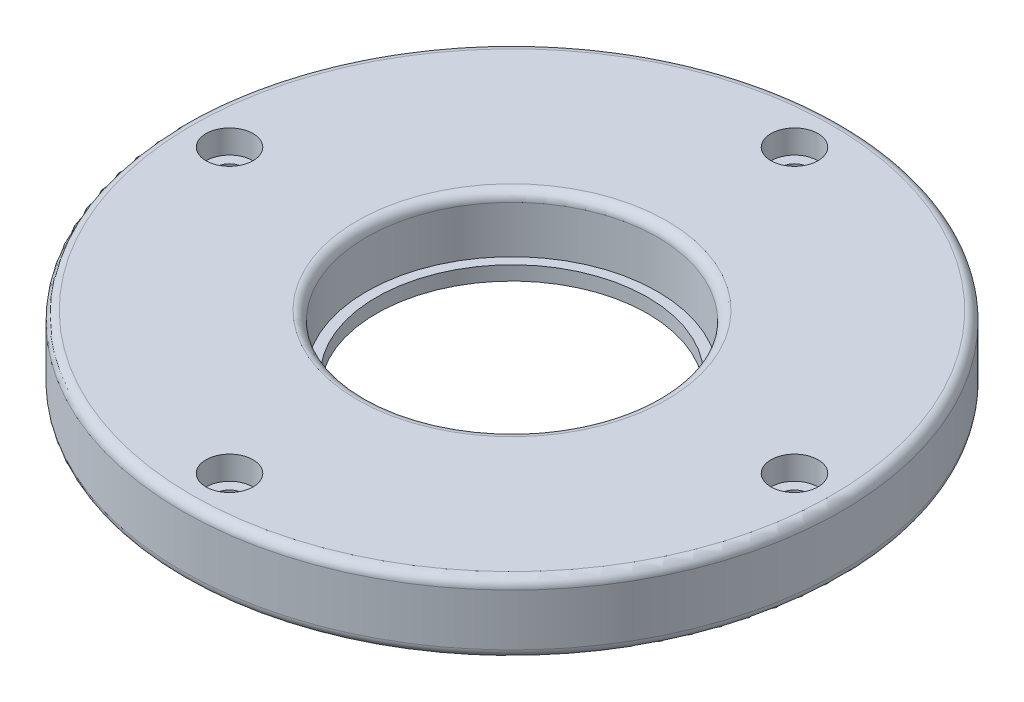
ISO-10303-21;
HEADER;
FILE_DESCRIPTION(('STEP AP214'),'2;1');
FILE_NAME('part.step','',(''),(''),'','','');
FILE_SCHEMA(('AUTOMOTIVE_DESIGN { 1 0 10303 214 1 1 1 1 }'));
ENDSEC;
DATA;
#1=APPLICATION_CONTEXT('core data for automotive mechanical design processes');
#2=APPLICATION_PROTOCOL_DEFINITION('international standard','automotive_design',2000,#1);
#3=PRODUCT_CONTEXT('',#1,'mechanical');
#4=PRODUCT('Part','Part','',(#3));
#5=PRODUCT_RELATED_PRODUCT_CATEGORY('part','',(#4));
#6=PRODUCT_DEFINITION_FORMATION('','',#4);
#7=PRODUCT_DEFINITION_CONTEXT('part definition',#1,'design');
#8=PRODUCT_DEFINITION('design','',#6,#7);
#9=PRODUCT_DEFINITION_SHAPE('','',#8);
#10=(LENGTH_UNIT() NAMED_UNIT(*) SI_UNIT(.MILLI.,.METRE.));
#11=(NAMED_UNIT(*) PLANE_ANGLE_UNIT() SI_UNIT($,.RADIAN.));
#12=(NAMED_UNIT(*) SI_UNIT($,.STERADIAN.) SOLID_ANGLE_UNIT());
#13=UNCERTAINTY_MEASURE_WITH_UNIT(LENGTH_MEASURE(1.E-05),#10,'distance_accuracy_value','');
#14=(GEOMETRIC_REPRESENTATION_CONTEXT(3) GLOBAL_UNCERTAINTY_ASSIGNED_CONTEXT((#13)) GLOBAL_UNIT_ASSIGNED_CONTEXT((#10,
#11,#12)) REPRESENTATION_CONTEXT('',''));
#15=CARTESIAN_POINT('',(0.,0.,0.));
#16=DIRECTION('',(0.,0.,1.));
#17=DIRECTION('',(1.,0.,0.));
#18=AXIS2_PLACEMENT_3D('',#15,#16,#17);
#19=CARTESIAN_POINT('',(0.,15.,0.));
#20=DIRECTION('',(0.,-1.,0.));
#21=DIRECTION('',(0.,0.,-1.));
#22=AXIS2_PLACEMENT_3D('',#19,#20,#21);
#23=CYLINDRICAL_SURFACE('',#22,70.);
#24=CARTESIAN_POINT('',(0.,2.,0.));
#25=DIRECTION('',(0.,1.,0.));
#26=DIRECTION('',(0.,0.,1.));
#27=AXIS2_PLACEMENT_3D('',#24,#25,#26);
#28=CIRCLE('',#27,70.);
#29=CARTESIAN_POINT('',(0.,2.,70.));
#30=VERTEX_POINT('',#29);
#31=EDGE_CURVE('E65',#30,#30,#28,.T.);
#32=ORIENTED_EDGE('',*,*,#31,.T.);
#33=EDGE_LOOP('',(#32));
#34=FACE_BOUND('',#33,.T.);
#35=CARTESIAN_POINT('',(0.,13.,0.));
#36=DIRECTION('',(0.,1.,0.));
#37=DIRECTION('',(0.,0.,1.));
#38=AXIS2_PLACEMENT_3D('',#35,#36,#37);
#39=CIRCLE('',#38,70.);
#40=CARTESIAN_POINT('',(0.,13.,70.));
#41=VERTEX_POINT('',#40);
#42=EDGE_CURVE('E69',#41,#41,#39,.F.);
#43=ORIENTED_EDGE('',*,*,#42,.T.);
#44=EDGE_LOOP('',(#43));
#45=FACE_BOUND('',#44,.T.);
#46=ADVANCED_FACE('F41',(#34,#45),#23,.T.);
#47=CARTESIAN_POINT('',(0.,15.,0.));
#48=DIRECTION('',(0.,1.,0.));
#49=DIRECTION('',(0.,0.,1.));
#50=AXIS2_PLACEMENT_3D('',#47,#48,#49);
#51=PLANE('',#50);
#52=CARTESIAN_POINT('',(0.,15.,-60.));
#53=DIRECTION('',(0.,1.,0.));
#54=DIRECTION('',(0.,0.,1.));
#55=AXIS2_PLACEMENT_3D('',#52,#53,#54);
#56=CIRCLE('',#55,5.);
#57=CARTESIAN_POINT('',(0.,15.,-55.));
#58=VERTEX_POINT('',#57);
#59=EDGE_CURVE('E145',#58,#58,#56,.T.);
#60=ORIENTED_EDGE('',*,*,#59,.F.);
#61=EDGE_LOOP('',(#60));
#62=FACE_BOUND('',#61,.T.);
#63=CARTESIAN_POINT('',(60.,15.,0.));
#64=DIRECTION('',(0.,1.,0.));
#65=DIRECTION('',(0.,0.,1.));
#66=AXIS2_PLACEMENT_3D('',#63,#64,#65);
#67=CIRCLE('',#66,5.);
#68=CARTESIAN_POINT('',(60.,15.,4.99999999999998));
#69=VERTEX_POINT('',#68);
#70=EDGE_CURVE('E129',#69,#69,#67,.T.);
#71=ORIENTED_EDGE('',*,*,#70,.F.);
#72=EDGE_LOOP('',(#71));
#73=FACE_BOUND('',#72,.T.);
#74=CARTESIAN_POINT('',(-60.,15.,0.));
#75=DIRECTION('',(0.,1.,0.));
#76=DIRECTION('',(0.,0.,1.));
#77=AXIS2_PLACEMENT_3D('',#74,#75,#76);
#78=CIRCLE('',#77,5.);
#79=CARTESIAN_POINT('',(-60.,15.,5.));
#80=VERTEX_POINT('',#79);
#81=EDGE_CURVE('E113',#80,#80,#78,.T.);
#82=ORIENTED_EDGE('',*,*,#81,.F.);
#83=EDGE_LOOP('',(#82));
#84=FACE_BOUND('',#83,.T.);
#85=CARTESIAN_POINT('',(0.,15.,60.));
#86=DIRECTION('',(0.,1.,0.));
#87=DIRECTION('',(0.,0.,1.));
#88=AXIS2_PLACEMENT_3D('',#85,#86,#87);
#89=CIRCLE('',#88,5.);
#90=CARTESIAN_POINT('',(0.,15.,65.));
#91=VERTEX_POINT('',#90);
#92=EDGE_CURVE('E97',#91,#91,#89,.T.);
#93=ORIENTED_EDGE('',*,*,#92,.F.);
#94=EDGE_LOOP('',(#93));
#95=FACE_BOUND('',#94,.T.);
#96=CARTESIAN_POINT('',(0.,15.,0.));
#97=DIRECTION('',(0.,1.,0.));
#98=DIRECTION('',(0.,0.,1.));
#99=AXIS2_PLACEMENT_3D('',#96,#97,#98);
#100=CIRCLE('',#99,68.);
#101=CARTESIAN_POINT('',(0.,15.,68.));
#102=VERTEX_POINT('',#101);
#103=EDGE_CURVE('E49',#102,#102,#100,.T.);
#104=ORIENTED_EDGE('',*,*,#103,.T.);
#105=EDGE_LOOP('',(#104));
#106=FACE_BOUND('',#105,.T.);
#107=CARTESIAN_POINT('',(0.,15.,0.));
#108=DIRECTION('',(0.,1.,0.));
#109=DIRECTION('',(0.,0.,1.));
#110=AXIS2_PLACEMENT_3D('',#107,#108,#109);
#111=CIRCLE('',#110,32.9);
#112=CARTESIAN_POINT('',(0.,15.,32.9));
#113=VERTEX_POINT('',#112);
#114=EDGE_CURVE('E54',#113,#113,#111,.F.);
#115=ORIENTED_EDGE('',*,*,#114,.T.);
#116=EDGE_LOOP('',(#115));
#117=FACE_BOUND('',#116,.T.);
#118=ADVANCED_FACE('F152',(#62,#73,#84,#95,#106,#117),#51,.T.);
#119=CARTESIAN_POINT('',(0.,0.,0.));
#120=DIRECTION('',(0.,1.,0.));
#121=DIRECTION('',(0.,0.,1.));
#122=AXIS2_PLACEMENT_3D('',#119,#120,#121);
#123=PLANE('',#122);
#124=CARTESIAN_POINT('',(0.,0.,-60.));
#125=DIRECTION('',(0.,1.,0.));
#126=DIRECTION('',(0.,0.,1.));
#127=AXIS2_PLACEMENT_3D('',#124,#125,#126);
#128=CIRCLE('',#127,2.75);
#129=CARTESIAN_POINT('',(0.,0.,-57.25));
#130=VERTEX_POINT('',#129);
#131=EDGE_CURVE('E133',#130,#130,#128,.T.);
#132=ORIENTED_EDGE('',*,*,#131,.T.);
#133=EDGE_LOOP('',(#132));
#134=FACE_BOUND('',#133,.T.);
#135=CARTESIAN_POINT('',(60.,0.,0.));
#136=DIRECTION('',(0.,1.,0.));
#137=DIRECTION('',(0.,0.,1.));
#138=AXIS2_PLACEMENT_3D('',#135,#136,#137);
#139=CIRCLE('',#138,2.75);
#140=CARTESIAN_POINT('',(60.,0.,2.74999999999998));
#141=VERTEX_POINT('',#140);
#142=EDGE_CURVE('E117',#141,#141,#139,.T.);
#143=ORIENTED_EDGE('',*,*,#142,.T.);
#144=EDGE_LOOP('',(#143));
#145=FACE_BOUND('',#144,.T.);
#146=CARTESIAN_POINT('',(-60.,0.,0.));
#147=DIRECTION('',(0.,1.,0.));
#148=DIRECTION('',(0.,0.,1.));
#149=AXIS2_PLACEMENT_3D('',#146,#147,#148);
#150=CIRCLE('',#149,2.75);
#151=CARTESIAN_POINT('',(-60.,0.,2.75));
#152=VERTEX_POINT('',#151);
#153=EDGE_CURVE('E101',#152,#152,#150,.T.);
#154=ORIENTED_EDGE('',*,*,#153,.T.);
#155=EDGE_LOOP('',(#154));
#156=FACE_BOUND('',#155,.T.);
#157=CARTESIAN_POINT('',(0.,0.,60.));
#158=DIRECTION('',(0.,1.,0.));
#159=DIRECTION('',(0.,0.,1.));
#160=AXIS2_PLACEMENT_3D('',#157,#158,#159);
#161=CIRCLE('',#160,2.75);
#162=CARTESIAN_POINT('',(0.,0.,62.75));
#163=VERTEX_POINT('',#162);
#164=EDGE_CURVE('E82',#163,#163,#161,.T.);
#165=ORIENTED_EDGE('',*,*,#164,.T.);
#166=EDGE_LOOP('',(#165));
#167=FACE_BOUND('',#166,.T.);
#168=CARTESIAN_POINT('',(0.,0.,0.));
#169=DIRECTION('',(0.,1.,0.));
#170=DIRECTION('',(0.,0.,1.));
#171=AXIS2_PLACEMENT_3D('',#168,#169,#170);
#172=CIRCLE('',#171,68.);
#173=CARTESIAN_POINT('',(0.,0.,68.));
#174=VERTEX_POINT('',#173);
#175=EDGE_CURVE('E59',#174,#174,#172,.F.);
#176=ORIENTED_EDGE('',*,*,#175,.T.);
#177=EDGE_LOOP('',(#176));
#178=FACE_BOUND('',#177,.T.);
#179=CARTESIAN_POINT('',(0.,0.,0.));
#180=DIRECTION('',(0.,1.,0.));
#181=DIRECTION('',(0.,0.,1.));
#182=AXIS2_PLACEMENT_3D('',#179,#180,#181);
#183=CIRCLE('',#182,28.8);
#184=CARTESIAN_POINT('',(0.,0.,28.8));
#185=VERTEX_POINT('',#184);
#186=EDGE_CURVE('E77',#185,#185,#183,.T.);
#187=ORIENTED_EDGE('',*,*,#186,.T.);
#188=EDGE_LOOP('',(#187));
#189=FACE_BOUND('',#188,.T.);
#190=ADVANCED_FACE('F155',(#134,#145,#156,#167,#178,#189),#123,.F.);
#191=CARTESIAN_POINT('',(0.,3.,0.));
#192=DIRECTION('',(0.,1.,0.));
#193=DIRECTION('',(0.,0.,1.));
#194=AXIS2_PLACEMENT_3D('',#191,#192,#193);
#195=CYLINDRICAL_SURFACE('',#194,30.9);
#196=CARTESIAN_POINT('',(0.,13.,0.));
#197=DIRECTION('',(0.,1.,0.));
#198=DIRECTION('',(0.,0.,1.));
#199=AXIS2_PLACEMENT_3D('',#196,#197,#198);
#200=CIRCLE('',#199,30.9);
#201=CARTESIAN_POINT('',(0.,13.,30.9));
#202=VERTEX_POINT('',#201);
#203=EDGE_CURVE('E10',#202,#202,#200,.T.);
#204=ORIENTED_EDGE('',*,*,#203,.T.);
#205=EDGE_LOOP('',(#204));
#206=FACE_BOUND('',#205,.T.);
#207=CARTESIAN_POINT('',(0.,3.,0.));
#208=DIRECTION('',(0.,1.,0.));
#209=DIRECTION('',(0.,0.,1.));
#210=AXIS2_PLACEMENT_3D('',#207,#208,#209);
#211=CIRCLE('',#210,30.9);
#212=CARTESIAN_POINT('',(0.,3.,30.9));
#213=VERTEX_POINT('',#212);
#214=EDGE_CURVE('E73',#213,#213,#211,.T.);
#215=ORIENTED_EDGE('',*,*,#214,.F.);
#216=EDGE_LOOP('',(#215));
#217=FACE_BOUND('',#216,.T.);
#218=ADVANCED_FACE('F201',(#206,#217),#195,.F.);
#219=CARTESIAN_POINT('',(0.,3.,0.));
#220=DIRECTION('',(0.,1.,0.));
#221=DIRECTION('',(0.,0.,1.));
#222=AXIS2_PLACEMENT_3D('',#219,#220,#221);
#223=PLANE('',#222);
#224=CARTESIAN_POINT('',(0.,3.,0.));
#225=DIRECTION('',(0.,1.,0.));
#226=DIRECTION('',(0.,0.,1.));
#227=AXIS2_PLACEMENT_3D('',#224,#225,#226);
#228=CIRCLE('',#227,28.8);
#229=CARTESIAN_POINT('',(0.,3.,28.8));
#230=VERTEX_POINT('',#229);
#231=EDGE_CURVE('E78',#230,#230,#228,.T.);
#232=ORIENTED_EDGE('',*,*,#231,.F.);
#233=EDGE_LOOP('',(#232));
#234=FACE_BOUND('',#233,.T.);
#235=ORIENTED_EDGE('',*,*,#214,.T.);
#236=EDGE_LOOP('',(#235));
#237=FACE_BOUND('',#236,.T.);
#238=ADVANCED_FACE('F192',(#234,#237),#223,.T.);
#239=CARTESIAN_POINT('',(0.,0.,0.));
#240=DIRECTION('',(0.,1.,0.));
#241=DIRECTION('',(0.,0.,1.));
#242=AXIS2_PLACEMENT_3D('',#239,#240,#241);
#243=CYLINDRICAL_SURFACE('',#242,28.8);
#244=ORIENTED_EDGE('',*,*,#186,.F.);
#245=EDGE_LOOP('',(#244));
#246=FACE_BOUND('',#245,.T.);
#247=ORIENTED_EDGE('',*,*,#231,.T.);
#248=EDGE_LOOP('',(#247));
#249=FACE_BOUND('',#248,.T.);
#250=ADVANCED_FACE('F187',(#246,#249),#243,.F.);
#251=CARTESIAN_POINT('',(0.,2.,0.));
#252=DIRECTION('',(0.,1.,0.));
#253=DIRECTION('',(0.,0.,1.));
#254=AXIS2_PLACEMENT_3D('',#251,#252,#253);
#255=TOROIDAL_SURFACE('',#254,68.,2.);
#256=ORIENTED_EDGE('',*,*,#175,.F.);
#257=EDGE_LOOP('',(#256));
#258=FACE_BOUND('',#257,.T.);
#259=ORIENTED_EDGE('',*,*,#31,.F.);
#260=EDGE_LOOP('',(#259));
#261=FACE_BOUND('',#260,.T.);
#262=ADVANCED_FACE('F176',(#258,#261),#255,.T.);
#263=CARTESIAN_POINT('',(0.,13.,0.));
#264=DIRECTION('',(0.,1.,0.));
#265=DIRECTION('',(0.,0.,1.));
#266=AXIS2_PLACEMENT_3D('',#263,#264,#265);
#267=TOROIDAL_SURFACE('',#266,68.,2.);
#268=ORIENTED_EDGE('',*,*,#42,.F.);
#269=EDGE_LOOP('',(#268));
#270=FACE_BOUND('',#269,.T.);
#271=ORIENTED_EDGE('',*,*,#103,.F.);
#272=EDGE_LOOP('',(#271));
#273=FACE_BOUND('',#272,.T.);
#274=ADVANCED_FACE('F168',(#270,#273),#267,.T.);
#275=CARTESIAN_POINT('',(0.,13.,0.));
#276=DIRECTION('',(0.,1.,0.));
#277=DIRECTION('',(0.,0.,1.));
#278=AXIS2_PLACEMENT_3D('',#275,#276,#277);
#279=TOROIDAL_SURFACE('',#278,32.9,2.);
#280=ORIENTED_EDGE('',*,*,#114,.F.);
#281=EDGE_LOOP('',(#280));
#282=FACE_BOUND('',#281,.T.);
#283=ORIENTED_EDGE('',*,*,#203,.F.);
#284=EDGE_LOOP('',(#283));
#285=FACE_BOUND('',#284,.T.);
#286=ADVANCED_FACE('F43',(#282,#285),#279,.T.);
#287=CARTESIAN_POINT('',(0.,15.,60.));
#288=DIRECTION('',(0.,1.,0.));
#289=DIRECTION('',(0.,0.,1.));
#290=AXIS2_PLACEMENT_3D('',#287,#288,#289);
#291=CYLINDRICAL_SURFACE('',#290,2.75);
#292=ORIENTED_EDGE('',*,*,#164,.F.);
#293=EDGE_LOOP('',(#292));
#294=FACE_BOUND('',#293,.T.);
#295=CARTESIAN_POINT('',(0.,10.,60.));
#296=DIRECTION('',(0.,1.,0.));
#297=DIRECTION('',(0.,0.,1.));
#298=AXIS2_PLACEMENT_3D('',#295,#296,#297);
#299=CIRCLE('',#298,2.75);
#300=CARTESIAN_POINT('',(0.,10.,62.75));
#301=VERTEX_POINT('',#300);
#302=EDGE_CURVE('E89',#301,#301,#299,.T.);
#303=ORIENTED_EDGE('',*,*,#302,.T.);
#304=EDGE_LOOP('',(#303));
#305=FACE_BOUND('',#304,.T.);
#306=ADVANCED_FACE('F167',(#294,#305),#291,.F.);
#307=CARTESIAN_POINT('',(2.75000000000001,10.,60.));
#308=DIRECTION('',(0.,-1.,0.));
#309=DIRECTION('',(0.,0.,-1.));
#310=AXIS2_PLACEMENT_3D('',#307,#308,#309);
#311=PLANE('',#310);
#312=ORIENTED_EDGE('',*,*,#302,.F.);
#313=EDGE_LOOP('',(#312));
#314=FACE_BOUND('',#313,.T.);
#315=CARTESIAN_POINT('',(0.,10.,60.));
#316=DIRECTION('',(0.,1.,0.));
#317=DIRECTION('',(0.,0.,1.));
#318=AXIS2_PLACEMENT_3D('',#315,#316,#317);
#319=CIRCLE('',#318,5.);
#320=CARTESIAN_POINT('',(0.,10.,65.));
#321=VERTEX_POINT('',#320);
#322=EDGE_CURVE('E93',#321,#321,#319,.T.);
#323=ORIENTED_EDGE('',*,*,#322,.T.);
#324=EDGE_LOOP('',(#323));
#325=FACE_BOUND('',#324,.T.);
#326=ADVANCED_FACE('F173',(#314,#325),#311,.F.);
#327=CARTESIAN_POINT('',(0.,15.,60.));
#328=DIRECTION('',(0.,1.,0.));
#329=DIRECTION('',(0.,0.,1.));
#330=AXIS2_PLACEMENT_3D('',#327,#328,#329);
#331=CYLINDRICAL_SURFACE('',#330,5.);
#332=ORIENTED_EDGE('',*,*,#322,.F.);
#333=EDGE_LOOP('',(#332));
#334=FACE_BOUND('',#333,.T.);
#335=ORIENTED_EDGE('',*,*,#92,.T.);
#336=EDGE_LOOP('',(#335));
#337=FACE_BOUND('',#336,.T.);
#338=ADVANCED_FACE('F219',(#334,#337),#331,.F.);
#339=CARTESIAN_POINT('',(-60.,15.,0.));
#340=DIRECTION('',(0.,1.,0.));
#341=DIRECTION('',(0.,0.,1.));
#342=AXIS2_PLACEMENT_3D('',#339,#340,#341);
#343=CYLINDRICAL_SURFACE('',#342,2.75);
#344=ORIENTED_EDGE('',*,*,#153,.F.);
#345=EDGE_LOOP('',(#344));
#346=FACE_BOUND('',#345,.T.);
#347=CARTESIAN_POINT('',(-60.,10.,0.));
#348=DIRECTION('',(0.,1.,0.));
#349=DIRECTION('',(0.,0.,1.));
#350=AXIS2_PLACEMENT_3D('',#347,#348,#349);
#351=CIRCLE('',#350,2.75);
#352=CARTESIAN_POINT('',(-60.,10.,2.75));
#353=VERTEX_POINT('',#352);
#354=EDGE_CURVE('E105',#353,#353,#351,.T.);
#355=ORIENTED_EDGE('',*,*,#354,.T.);
#356=EDGE_LOOP('',(#355));
#357=FACE_BOUND('',#356,.T.);
#358=ADVANCED_FACE('F223',(#346,#357),#343,.F.);
#359=CARTESIAN_POINT('',(-57.25,10.,0.));
#360=DIRECTION('',(0.,-1.,0.));
#361=DIRECTION('',(0.,0.,-1.));
#362=AXIS2_PLACEMENT_3D('',#359,#360,#361);
#363=PLANE('',#362);
#364=ORIENTED_EDGE('',*,*,#354,.F.);
#365=EDGE_LOOP('',(#364));
#366=FACE_BOUND('',#365,.T.);
#367=CARTESIAN_POINT('',(-60.,10.,0.));
#368=DIRECTION('',(0.,1.,0.));
#369=DIRECTION('',(0.,0.,1.));
#370=AXIS2_PLACEMENT_3D('',#367,#368,#369);
#371=CIRCLE('',#370,5.);
#372=CARTESIAN_POINT('',(-60.,10.,5.));
#373=VERTEX_POINT('',#372);
#374=EDGE_CURVE('E109',#373,#373,#371,.T.);
#375=ORIENTED_EDGE('',*,*,#374,.T.);
#376=EDGE_LOOP('',(#375));
#377=FACE_BOUND('',#376,.T.);
#378=ADVANCED_FACE('F227',(#366,#377),#363,.F.);
#379=CARTESIAN_POINT('',(-60.,15.,0.));
#380=DIRECTION('',(0.,1.,0.));
#381=DIRECTION('',(0.,0.,1.));
#382=AXIS2_PLACEMENT_3D('',#379,#380,#381);
#383=CYLINDRICAL_SURFACE('',#382,5.);
#384=ORIENTED_EDGE('',*,*,#374,.F.);
#385=EDGE_LOOP('',(#384));
#386=FACE_BOUND('',#385,.T.);
#387=ORIENTED_EDGE('',*,*,#81,.T.);
#388=EDGE_LOOP('',(#387));
#389=FACE_BOUND('',#388,.T.);
#390=ADVANCED_FACE('F231',(#386,#389),#383,.F.);
#391=CARTESIAN_POINT('',(60.,15.,0.));
#392=DIRECTION('',(0.,1.,0.));
#393=DIRECTION('',(0.,0.,1.));
#394=AXIS2_PLACEMENT_3D('',#391,#392,#393);
#395=CYLINDRICAL_SURFACE('',#394,2.75);
#396=ORIENTED_EDGE('',*,*,#142,.F.);
#397=EDGE_LOOP('',(#396));
#398=FACE_BOUND('',#397,.T.);
#399=CARTESIAN_POINT('',(60.,10.,0.));
#400=DIRECTION('',(0.,1.,0.));
#401=DIRECTION('',(0.,0.,1.));
#402=AXIS2_PLACEMENT_3D('',#399,#400,#401);
#403=CIRCLE('',#402,2.75);
#404=CARTESIAN_POINT('',(60.,10.,2.74999999999998));
#405=VERTEX_POINT('',#404);
#406=EDGE_CURVE('E121',#405,#405,#403,.T.);
#407=ORIENTED_EDGE('',*,*,#406,.T.);
#408=EDGE_LOOP('',(#407));
#409=FACE_BOUND('',#408,.T.);
#410=ADVANCED_FACE('F235',(#398,#409),#395,.F.);
#411=CARTESIAN_POINT('',(62.75,10.,0.));
#412=DIRECTION('',(0.,-1.,0.));
#413=DIRECTION('',(0.,0.,-1.));
#414=AXIS2_PLACEMENT_3D('',#411,#412,#413);
#415=PLANE('',#414);
#416=ORIENTED_EDGE('',*,*,#406,.F.);
#417=EDGE_LOOP('',(#416));
#418=FACE_BOUND('',#417,.T.);
#419=CARTESIAN_POINT('',(60.,10.,0.));
#420=DIRECTION('',(0.,1.,0.));
#421=DIRECTION('',(0.,0.,1.));
#422=AXIS2_PLACEMENT_3D('',#419,#420,#421);
#423=CIRCLE('',#422,5.);
#424=CARTESIAN_POINT('',(60.,10.,4.99999999999998));
#425=VERTEX_POINT('',#424);
#426=EDGE_CURVE('E125',#425,#425,#423,.T.);
#427=ORIENTED_EDGE('',*,*,#426,.T.);
#428=EDGE_LOOP('',(#427));
#429=FACE_BOUND('',#428,.T.);
#430=ADVANCED_FACE('F239',(#418,#429),#415,.F.);
#431=CARTESIAN_POINT('',(60.,15.,0.));
#432=DIRECTION('',(0.,1.,0.));
#433=DIRECTION('',(0.,0.,1.));
#434=AXIS2_PLACEMENT_3D('',#431,#432,#433);
#435=CYLINDRICAL_SURFACE('',#434,5.);
#436=ORIENTED_EDGE('',*,*,#426,.F.);
#437=EDGE_LOOP('',(#436));
#438=FACE_BOUND('',#437,.T.);
#439=ORIENTED_EDGE('',*,*,#70,.T.);
#440=EDGE_LOOP('',(#439));
#441=FACE_BOUND('',#440,.T.);
#442=ADVANCED_FACE('F243',(#438,#441),#435,.F.);
#443=CARTESIAN_POINT('',(0.,15.,-60.));
#444=DIRECTION('',(0.,1.,0.));
#445=DIRECTION('',(0.,0.,1.));
#446=AXIS2_PLACEMENT_3D('',#443,#444,#445);
#447=CYLINDRICAL_SURFACE('',#446,2.75);
#448=ORIENTED_EDGE('',*,*,#131,.F.);
#449=EDGE_LOOP('',(#448));
#450=FACE_BOUND('',#449,.T.);
#451=CARTESIAN_POINT('',(0.,10.,-60.));
#452=DIRECTION('',(0.,1.,0.));
#453=DIRECTION('',(0.,0.,1.));
#454=AXIS2_PLACEMENT_3D('',#451,#452,#453);
#455=CIRCLE('',#454,2.75);
#456=CARTESIAN_POINT('',(0.,10.,-57.25));
#457=VERTEX_POINT('',#456);
#458=EDGE_CURVE('E137',#457,#457,#455,.T.);
#459=ORIENTED_EDGE('',*,*,#458,.T.);
#460=EDGE_LOOP('',(#459));
#461=FACE_BOUND('',#460,.T.);
#462=ADVANCED_FACE('F247',(#450,#461),#447,.F.);
#463=CARTESIAN_POINT('',(2.74999999999998,10.,-60.));
#464=DIRECTION('',(0.,-1.,0.));
#465=DIRECTION('',(0.,0.,-1.));
#466=AXIS2_PLACEMENT_3D('',#463,#464,#465);
#467=PLANE('',#466);
#468=ORIENTED_EDGE('',*,*,#458,.F.);
#469=EDGE_LOOP('',(#468));
#470=FACE_BOUND('',#469,.T.);
#471=CARTESIAN_POINT('',(0.,10.,-60.));
#472=DIRECTION('',(0.,1.,0.));
#473=DIRECTION('',(0.,0.,1.));
#474=AXIS2_PLACEMENT_3D('',#471,#472,#473);
#475=CIRCLE('',#474,5.);
#476=CARTESIAN_POINT('',(0.,10.,-55.));
#477=VERTEX_POINT('',#476);
#478=EDGE_CURVE('E141',#477,#477,#475,.T.);
#479=ORIENTED_EDGE('',*,*,#478,.T.);
#480=EDGE_LOOP('',(#479));
#481=FACE_BOUND('',#480,.T.);
#482=ADVANCED_FACE('F251',(#470,#481),#467,.F.);
#483=CARTESIAN_POINT('',(0.,15.,-60.));
#484=DIRECTION('',(0.,1.,0.));
#485=DIRECTION('',(0.,0.,1.));
#486=AXIS2_PLACEMENT_3D('',#483,#484,#485);
#487=CYLINDRICAL_SURFACE('',#486,5.);
#488=ORIENTED_EDGE('',*,*,#478,.F.);
#489=EDGE_LOOP('',(#488));
#490=FACE_BOUND('',#489,.T.);
#491=ORIENTED_EDGE('',*,*,#59,.T.);
#492=EDGE_LOOP('',(#491));
#493=FACE_BOUND('',#492,.T.);
#494=ADVANCED_FACE('F150',(#490,#493),#487,.F.);
#495=CLOSED_SHELL('',(#46,#118,#190,#218,#238,#250,#262,#274,#286,#306,#326,#338,#358,#378,#390,
#410,#430,#442,#462,#482,#494));
#496=MANIFOLD_SOLID_BREP('B2',#495);
#497=ADVANCED_BREP_SHAPE_REPRESENTATION('',(#18,#496),#14);
#498=SHAPE_DEFINITION_REPRESENTATION(#9,#497);
ENDSEC;
END-ISO-10303-21;
